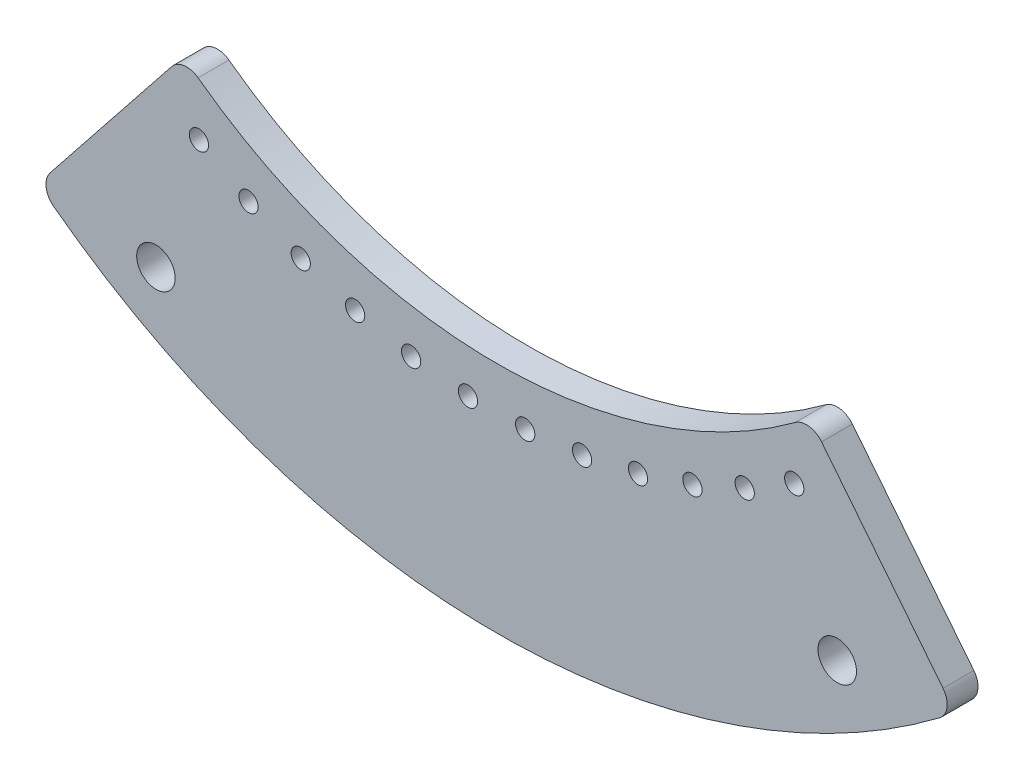
ISO-10303-21;
HEADER;
FILE_DESCRIPTION(('STEP AP214'),'2;1');
FILE_NAME('part.step','',(''),(''),'','','');
FILE_SCHEMA(('AUTOMOTIVE_DESIGN { 1 0 10303 214 1 1 1 1 }'));
ENDSEC;
DATA;
#1=APPLICATION_CONTEXT('core data for automotive mechanical design processes');
#2=APPLICATION_PROTOCOL_DEFINITION('international standard','automotive_design',2000,#1);
#3=PRODUCT_CONTEXT('',#1,'mechanical');
#4=PRODUCT('Part','Part','',(#3));
#5=PRODUCT_RELATED_PRODUCT_CATEGORY('part','',(#4));
#6=PRODUCT_DEFINITION_FORMATION('','',#4);
#7=PRODUCT_DEFINITION_CONTEXT('part definition',#1,'design');
#8=PRODUCT_DEFINITION('design','',#6,#7);
#9=PRODUCT_DEFINITION_SHAPE('','',#8);
#10=(LENGTH_UNIT() NAMED_UNIT(*) SI_UNIT(.MILLI.,.METRE.));
#11=(NAMED_UNIT(*) PLANE_ANGLE_UNIT() SI_UNIT($,.RADIAN.));
#12=(NAMED_UNIT(*) SI_UNIT($,.STERADIAN.) SOLID_ANGLE_UNIT());
#13=UNCERTAINTY_MEASURE_WITH_UNIT(LENGTH_MEASURE(1.E-05),#10,'distance_accuracy_value','');
#14=(GEOMETRIC_REPRESENTATION_CONTEXT(3) GLOBAL_UNCERTAINTY_ASSIGNED_CONTEXT((#13)) GLOBAL_UNIT_ASSIGNED_CONTEXT((#10,
#11,#12)) REPRESENTATION_CONTEXT('',''));
#15=CARTESIAN_POINT('',(0.,0.,0.));
#16=DIRECTION('',(0.,0.,1.));
#17=DIRECTION('',(1.,0.,0.));
#18=AXIS2_PLACEMENT_3D('',#15,#16,#17);
#19=CARTESIAN_POINT('',(0.,0.,1.6));
#20=DIRECTION('',(0.,0.,-1.));
#21=DIRECTION('',(-1.,0.,0.));
#22=AXIS2_PLACEMENT_3D('',#19,#20,#21);
#23=CYLINDRICAL_SURFACE('',#22,26.125);
#24=CARTESIAN_POINT('',(0.,0.,1.6));
#25=DIRECTION('',(0.,0.,-1.));
#26=DIRECTION('',(1.,0.,0.));
#27=AXIS2_PLACEMENT_3D('',#24,#25,#26);
#28=CIRCLE('',#27,26.125);
#29=CARTESIAN_POINT('',(15.4983829956367,-21.0313040375665,1.6));
#30=VERTEX_POINT('',#29);
#31=CARTESIAN_POINT('',(-15.4983829956367,-21.0313040375665,1.6));
#32=VERTEX_POINT('',#31);
#33=EDGE_CURVE('E120',#30,#32,#28,.T.);
#34=ORIENTED_EDGE('',*,*,#33,.F.);
#35=DIRECTION('',(0.,0.,-1.));
#36=VECTOR('',#35,1.);
#37=CARTESIAN_POINT('',(15.4983829956367,-21.0313040375665,1.6));
#38=LINE('',#37,#36);
#39=CARTESIAN_POINT('',(15.4983829956367,-21.0313040375665,0.));
#40=VERTEX_POINT('',#39);
#41=EDGE_CURVE('E105',#30,#40,#38,.T.);
#42=ORIENTED_EDGE('',*,*,#41,.T.);
#43=CARTESIAN_POINT('',(0.,0.,0.));
#44=DIRECTION('',(0.,0.,-1.));
#45=DIRECTION('',(1.,0.,0.));
#46=AXIS2_PLACEMENT_3D('',#43,#44,#45);
#47=CIRCLE('',#46,26.125);
#48=CARTESIAN_POINT('',(-15.4983829956367,-21.0313040375665,0.));
#49=VERTEX_POINT('',#48);
#50=EDGE_CURVE('E117',#40,#49,#47,.T.);
#51=ORIENTED_EDGE('',*,*,#50,.T.);
#52=DIRECTION('',(0.,0.,-1.));
#53=VECTOR('',#52,1.);
#54=CARTESIAN_POINT('',(-15.4983829956367,-21.0313040375665,1.6));
#55=LINE('',#54,#53);
#56=EDGE_CURVE('E122',#49,#32,#55,.F.);
#57=ORIENTED_EDGE('',*,*,#56,.T.);
#58=EDGE_LOOP('',(#34,#42,#51,#57));
#59=FACE_BOUND('',#58,.T.);
#60=ADVANCED_FACE('F35',(#59),#23,.F.);
#61=CARTESIAN_POINT('',(-16.2631948821578,-20.4456380977693,1.6));
#62=DIRECTION('',(0.782608156852413,-0.62251463663762,0.));
#63=DIRECTION('',(0.62251463663762,0.782608156852413,0.));
#64=AXIS2_PLACEMENT_3D('',#61,#62,#63);
#65=PLANE('',#64);
#66=DIRECTION('',(-0.62251463663762,-0.782608156852413,0.));
#67=VECTOR('',#66,1.);
#68=CARTESIAN_POINT('',(-16.2631948821578,-20.4456380977693,0.));
#69=LINE('',#68,#67);
#70=CARTESIAN_POINT('',(-16.8742306929919,-21.2138153927974,0.));
#71=VERTEX_POINT('',#70);
#72=CARTESIAN_POINT('',(-23.1803128075457,-29.1416471419227,0.));
#73=VERTEX_POINT('',#72);
#74=EDGE_CURVE('E126',#71,#73,#69,.T.);
#75=ORIENTED_EDGE('',*,*,#74,.T.);
#76=DIRECTION('',(0.,0.,-1.));
#77=VECTOR('',#76,1.);
#78=CARTESIAN_POINT('',(-23.1803128075457,-29.1416471419227,1.6));
#79=LINE('',#78,#77);
#80=CARTESIAN_POINT('',(-23.1803128075457,-29.1416471419227,1.6));
#81=VERTEX_POINT('',#80);
#82=EDGE_CURVE('E11',#73,#81,#79,.F.);
#83=ORIENTED_EDGE('',*,*,#82,.T.);
#84=DIRECTION('',(-0.62251463663762,-0.782608156852413,0.));
#85=VECTOR('',#84,1.);
#86=CARTESIAN_POINT('',(-16.2631948821578,-20.4456380977693,1.6));
#87=LINE('',#86,#85);
#88=CARTESIAN_POINT('',(-16.8742306929919,-21.2138153927974,1.6));
#89=VERTEX_POINT('',#88);
#90=EDGE_CURVE('E166',#89,#81,#87,.T.);
#91=ORIENTED_EDGE('',*,*,#90,.F.);
#92=DIRECTION('',(0.,0.,-1.));
#93=VECTOR('',#92,1.);
#94=CARTESIAN_POINT('',(-16.8742306929919,-21.2138153927974,1.6));
#95=LINE('',#94,#93);
#96=EDGE_CURVE('E43',#89,#71,#95,.T.);
#97=ORIENTED_EDGE('',*,*,#96,.T.);
#98=EDGE_LOOP('',(#75,#83,#91,#97));
#99=FACE_BOUND('',#98,.T.);
#100=ADVANCED_FACE('F164',(#99),#65,.F.);
#101=CARTESIAN_POINT('',(0.,0.,1.6));
#102=DIRECTION('',(0.,0.,-1.));
#103=DIRECTION('',(-1.,0.,0.));
#104=AXIS2_PLACEMENT_3D('',#101,#102,#103);
#105=CYLINDRICAL_SURFACE('',#104,38.25);
#106=CARTESIAN_POINT('',(0.,0.,0.));
#107=DIRECTION('',(0.,0.,1.));
#108=DIRECTION('',(1.,0.,0.));
#109=AXIS2_PLACEMENT_3D('',#106,#107,#108);
#110=CIRCLE('',#109,38.25);
#111=CARTESIAN_POINT('',(-22.9989853124569,-30.5631996786559,0.));
#112=VERTEX_POINT('',#111);
#113=CARTESIAN_POINT('',(22.9989853124569,-30.5631996786559,0.));
#114=VERTEX_POINT('',#113);
#115=EDGE_CURVE('E130',#112,#114,#110,.T.);
#116=ORIENTED_EDGE('',*,*,#115,.T.);
#117=DIRECTION('',(0.,0.,-1.));
#118=VECTOR('',#117,1.);
#119=CARTESIAN_POINT('',(22.9989853124569,-30.5631996786559,1.6));
#120=LINE('',#119,#118);
#121=CARTESIAN_POINT('',(22.9989853124569,-30.5631996786559,1.6));
#122=VERTEX_POINT('',#121);
#123=EDGE_CURVE('E50',#114,#122,#120,.F.);
#124=ORIENTED_EDGE('',*,*,#123,.T.);
#125=CARTESIAN_POINT('',(0.,0.,1.6));
#126=DIRECTION('',(0.,0.,1.));
#127=DIRECTION('',(1.,0.,0.));
#128=AXIS2_PLACEMENT_3D('',#125,#126,#127);
#129=CIRCLE('',#128,38.25);
#130=CARTESIAN_POINT('',(-22.9989853124569,-30.5631996786559,1.6));
#131=VERTEX_POINT('',#130);
#132=EDGE_CURVE('E174',#131,#122,#129,.T.);
#133=ORIENTED_EDGE('',*,*,#132,.F.);
#134=DIRECTION('',(0.,0.,-1.));
#135=VECTOR('',#134,1.);
#136=CARTESIAN_POINT('',(-22.9989853124569,-30.5631996786559,1.6));
#137=LINE('',#136,#135);
#138=EDGE_CURVE('E157',#131,#112,#137,.T.);
#139=ORIENTED_EDGE('',*,*,#138,.T.);
#140=EDGE_LOOP('',(#116,#124,#133,#139));
#141=FACE_BOUND('',#140,.T.);
#142=ADVANCED_FACE('F173',(#141),#105,.T.);
#143=CARTESIAN_POINT('',(16.2631948821578,-20.4456380977693,1.6));
#144=DIRECTION('',(-0.782608156852413,-0.62251463663762,0.));
#145=DIRECTION('',(0.62251463663762,-0.782608156852413,0.));
#146=AXIS2_PLACEMENT_3D('',#143,#144,#145);
#147=PLANE('',#146);
#148=DIRECTION('',(-0.62251463663762,0.782608156852413,0.));
#149=VECTOR('',#148,1.);
#150=CARTESIAN_POINT('',(16.2631948821578,-20.4456380977693,0.));
#151=LINE('',#150,#149);
#152=CARTESIAN_POINT('',(23.1803128075457,-29.1416471419227,0.));
#153=VERTEX_POINT('',#152);
#154=CARTESIAN_POINT('',(16.8742306929919,-21.2138153927974,0.));
#155=VERTEX_POINT('',#154);
#156=EDGE_CURVE('E140',#153,#155,#151,.T.);
#157=ORIENTED_EDGE('',*,*,#156,.T.);
#158=DIRECTION('',(0.,0.,-1.));
#159=VECTOR('',#158,1.);
#160=CARTESIAN_POINT('',(16.8742306929919,-21.2138153927974,1.6));
#161=LINE('',#160,#159);
#162=CARTESIAN_POINT('',(16.8742306929919,-21.2138153927974,1.6));
#163=VERTEX_POINT('',#162);
#164=EDGE_CURVE('E106',#155,#163,#161,.F.);
#165=ORIENTED_EDGE('',*,*,#164,.T.);
#166=DIRECTION('',(-0.62251463663762,0.782608156852413,0.));
#167=VECTOR('',#166,1.);
#168=CARTESIAN_POINT('',(16.2631948821578,-20.4456380977693,1.6));
#169=LINE('',#168,#167);
#170=CARTESIAN_POINT('',(23.1803128075457,-29.1416471419227,1.6));
#171=VERTEX_POINT('',#170);
#172=EDGE_CURVE('E136',#171,#163,#169,.T.);
#173=ORIENTED_EDGE('',*,*,#172,.F.);
#174=DIRECTION('',(0.,0.,-1.));
#175=VECTOR('',#174,1.);
#176=CARTESIAN_POINT('',(23.1803128075457,-29.1416471419227,1.6));
#177=LINE('',#176,#175);
#178=EDGE_CURVE('E111',#171,#153,#177,.T.);
#179=ORIENTED_EDGE('',*,*,#178,.T.);
#180=EDGE_LOOP('',(#157,#165,#173,#179));
#181=FACE_BOUND('',#180,.T.);
#182=ADVANCED_FACE('F273',(#181),#147,.F.);
#183=CARTESIAN_POINT('',(0.,0.,1.6));
#184=DIRECTION('',(0.,0.,1.));
#185=DIRECTION('',(1.,0.,0.));
#186=AXIS2_PLACEMENT_3D('',#183,#184,#185);
#187=PLANE('',#186);
#188=CARTESIAN_POINT('',(-17.6874999999998,-30.6356486588746,1.6));
#189=DIRECTION('',(0.,0.,1.));
#190=DIRECTION('',(1.,0.,0.));
#191=AXIS2_PLACEMENT_3D('',#188,#189,#190);
#192=CIRCLE('',#191,1.);
#193=CARTESIAN_POINT('',(-16.6874999999998,-30.6356486588746,1.6));
#194=VERTEX_POINT('',#193);
#195=EDGE_CURVE('E255',#194,#194,#192,.T.);
#196=ORIENTED_EDGE('',*,*,#195,.F.);
#197=EDGE_LOOP('',(#196));
#198=FACE_BOUND('',#197,.T.);
#199=CARTESIAN_POINT('',(17.6874999999998,-30.6356486588746,1.6));
#200=DIRECTION('',(0.,0.,1.));
#201=DIRECTION('',(1.,0.,0.));
#202=AXIS2_PLACEMENT_3D('',#199,#200,#201);
#203=CIRCLE('',#202,1.);
#204=CARTESIAN_POINT('',(18.6874999999998,-30.6356486588746,1.6));
#205=VERTEX_POINT('',#204);
#206=EDGE_CURVE('E249',#205,#205,#203,.T.);
#207=ORIENTED_EDGE('',*,*,#206,.F.);
#208=EDGE_LOOP('',(#207));
#209=FACE_BOUND('',#208,.T.);
#210=CARTESIAN_POINT('',(-15.4541326185514,-23.7972773654514,1.6));
#211=DIRECTION('',(0.,0.,1.));
#212=DIRECTION('',(1.,0.,0.));
#213=AXIS2_PLACEMENT_3D('',#210,#211,#212);
#214=CIRCLE('',#213,0.500000000000001);
#215=CARTESIAN_POINT('',(-14.9541326185514,-23.7972773654514,1.6));
#216=VERTEX_POINT('',#215);
#217=EDGE_CURVE('E133',#216,#216,#214,.T.);
#218=ORIENTED_EDGE('',*,*,#217,.F.);
#219=EDGE_LOOP('',(#218));
#220=FACE_BOUND('',#219,.T.);
#221=CARTESIAN_POINT('',(-12.8819804301097,-25.2823101238449,1.6));
#222=DIRECTION('',(0.,0.,1.));
#223=DIRECTION('',(1.,0.,0.));
#224=AXIS2_PLACEMENT_3D('',#221,#222,#223);
#225=CIRCLE('',#224,0.500000000000001);
#226=CARTESIAN_POINT('',(-12.3819804301097,-25.2823101238449,1.6));
#227=VERTEX_POINT('',#226);
#228=EDGE_CURVE('E241',#227,#227,#225,.T.);
#229=ORIENTED_EDGE('',*,*,#228,.F.);
#230=EDGE_LOOP('',(#229));
#231=FACE_BOUND('',#230,.T.);
#232=CARTESIAN_POINT('',(-10.1686905683479,-26.4903446018581,1.6));
#233=DIRECTION('',(0.,0.,1.));
#234=DIRECTION('',(1.,0.,0.));
#235=AXIS2_PLACEMENT_3D('',#232,#233,#234);
#236=CIRCLE('',#235,0.500000000000001);
#237=CARTESIAN_POINT('',(-9.66869056834791,-26.4903446018581,1.6));
#238=VERTEX_POINT('',#237);
#239=EDGE_CURVE('E235',#238,#238,#236,.T.);
#240=ORIENTED_EDGE('',*,*,#239,.F.);
#241=EDGE_LOOP('',(#240));
#242=FACE_BOUND('',#241,.T.);
#243=CARTESIAN_POINT('',(-7.34399040478404,-27.4081453209523,1.6));
#244=DIRECTION('',(0.,0.,1.));
#245=DIRECTION('',(1.,0.,0.));
#246=AXIS2_PLACEMENT_3D('',#243,#244,#245);
#247=CIRCLE('',#246,0.500000000000003);
#248=CARTESIAN_POINT('',(-6.84399040478403,-27.4081453209523,1.6));
#249=VERTEX_POINT('',#248);
#250=EDGE_CURVE('E229',#249,#249,#247,.T.);
#251=ORIENTED_EDGE('',*,*,#250,.F.);
#252=EDGE_LOOP('',(#251));
#253=FACE_BOUND('',#252,.T.);
#254=CARTESIAN_POINT('',(-4.43882794551655,-28.025656664387,1.6));
#255=DIRECTION('',(0.,0.,1.));
#256=DIRECTION('',(1.,0.,0.));
#257=AXIS2_PLACEMENT_3D('',#254,#255,#256);
#258=CIRCLE('',#257,0.500000000000001);
#259=CARTESIAN_POINT('',(-3.93882794551655,-28.025656664387,1.6));
#260=VERTEX_POINT('',#259);
#261=EDGE_CURVE('E223',#260,#260,#258,.T.);
#262=ORIENTED_EDGE('',*,*,#261,.F.);
#263=EDGE_LOOP('',(#262));
#264=FACE_BOUND('',#263,.T.);
#265=CARTESIAN_POINT('',(-1.48503275839352,-28.336113048661,1.6));
#266=DIRECTION('',(0.,0.,1.));
#267=DIRECTION('',(1.,0.,0.));
#268=AXIS2_PLACEMENT_3D('',#265,#266,#267);
#269=CIRCLE('',#268,0.500000000000002);
#270=CARTESIAN_POINT('',(-0.985032758393521,-28.336113048661,1.6));
#271=VERTEX_POINT('',#270);
#272=EDGE_CURVE('E217',#271,#271,#269,.T.);
#273=ORIENTED_EDGE('',*,*,#272,.F.);
#274=EDGE_LOOP('',(#273));
#275=FACE_BOUND('',#274,.T.);
#276=CARTESIAN_POINT('',(1.48503275839354,-28.336113048661,1.6));
#277=DIRECTION('',(0.,0.,1.));
#278=DIRECTION('',(1.,0.,0.));
#279=AXIS2_PLACEMENT_3D('',#276,#277,#278);
#280=CIRCLE('',#279,0.5);
#281=CARTESIAN_POINT('',(1.98503275839354,-28.336113048661,1.6));
#282=VERTEX_POINT('',#281);
#283=EDGE_CURVE('E211',#282,#282,#280,.T.);
#284=ORIENTED_EDGE('',*,*,#283,.F.);
#285=EDGE_LOOP('',(#284));
#286=FACE_BOUND('',#285,.T.);
#287=CARTESIAN_POINT('',(4.43882794551656,-28.025656664387,1.6));
#288=DIRECTION('',(0.,0.,1.));
#289=DIRECTION('',(1.,0.,0.));
#290=AXIS2_PLACEMENT_3D('',#287,#288,#289);
#291=CIRCLE('',#290,0.500000000000002);
#292=CARTESIAN_POINT('',(4.93882794551657,-28.025656664387,1.6));
#293=VERTEX_POINT('',#292);
#294=EDGE_CURVE('E205',#293,#293,#291,.T.);
#295=ORIENTED_EDGE('',*,*,#294,.F.);
#296=EDGE_LOOP('',(#295));
#297=FACE_BOUND('',#296,.T.);
#298=CARTESIAN_POINT('',(7.34399040478405,-27.4081453209523,1.6));
#299=DIRECTION('',(0.,0.,1.));
#300=DIRECTION('',(1.,0.,0.));
#301=AXIS2_PLACEMENT_3D('',#298,#299,#300);
#302=CIRCLE('',#301,0.500000000000008);
#303=CARTESIAN_POINT('',(7.84399040478406,-27.4081453209523,1.6));
#304=VERTEX_POINT('',#303);
#305=EDGE_CURVE('E199',#304,#304,#302,.T.);
#306=ORIENTED_EDGE('',*,*,#305,.F.);
#307=EDGE_LOOP('',(#306));
#308=FACE_BOUND('',#307,.T.);
#309=CARTESIAN_POINT('',(10.1686905683479,-26.4903446018581,1.6));
#310=DIRECTION('',(0.,0.,1.));
#311=DIRECTION('',(1.,0.,0.));
#312=AXIS2_PLACEMENT_3D('',#309,#310,#311);
#313=CIRCLE('',#312,0.499999999999996);
#314=CARTESIAN_POINT('',(10.6686905683479,-26.4903446018581,1.6));
#315=VERTEX_POINT('',#314);
#316=EDGE_CURVE('E193',#315,#315,#313,.T.);
#317=ORIENTED_EDGE('',*,*,#316,.F.);
#318=EDGE_LOOP('',(#317));
#319=FACE_BOUND('',#318,.T.);
#320=CARTESIAN_POINT('',(12.8819804301097,-25.2823101238449,1.6));
#321=DIRECTION('',(0.,0.,1.));
#322=DIRECTION('',(1.,0.,0.));
#323=AXIS2_PLACEMENT_3D('',#320,#321,#322);
#324=CIRCLE('',#323,0.5);
#325=CARTESIAN_POINT('',(13.3819804301097,-25.2823101238449,1.6));
#326=VERTEX_POINT('',#325);
#327=EDGE_CURVE('E187',#326,#326,#324,.T.);
#328=ORIENTED_EDGE('',*,*,#327,.F.);
#329=EDGE_LOOP('',(#328));
#330=FACE_BOUND('',#329,.T.);
#331=CARTESIAN_POINT('',(15.4541326185514,-23.7972773654514,1.6));
#332=DIRECTION('',(0.,0.,1.));
#333=DIRECTION('',(1.,0.,0.));
#334=AXIS2_PLACEMENT_3D('',#331,#332,#333);
#335=CIRCLE('',#334,0.5);
#336=CARTESIAN_POINT('',(15.9541326185514,-23.7972773654514,1.6));
#337=VERTEX_POINT('',#336);
#338=EDGE_CURVE('E180',#337,#337,#335,.T.);
#339=ORIENTED_EDGE('',*,*,#338,.F.);
#340=EDGE_LOOP('',(#339));
#341=FACE_BOUND('',#340,.T.);
#342=ORIENTED_EDGE('',*,*,#172,.T.);
#343=CARTESIAN_POINT('',(16.0916225361395,-21.836330029435,1.6));
#344=DIRECTION('',(0.,0.,1.));
#345=DIRECTION('',(1.,0.,0.));
#346=AXIS2_PLACEMENT_3D('',#343,#344,#345);
#347=CIRCLE('',#346,1.);
#348=EDGE_CURVE('E155',#163,#30,#347,.T.);
#349=ORIENTED_EDGE('',*,*,#348,.T.);
#350=ORIENTED_EDGE('',*,*,#33,.T.);
#351=CARTESIAN_POINT('',(-16.0916225361395,-21.836330029435,1.6));
#352=DIRECTION('',(0.,0.,1.));
#353=DIRECTION('',(1.,0.,0.));
#354=AXIS2_PLACEMENT_3D('',#351,#352,#353);
#355=CIRCLE('',#354,1.);
#356=EDGE_CURVE('E150',#32,#89,#355,.T.);
#357=ORIENTED_EDGE('',*,*,#356,.T.);
#358=ORIENTED_EDGE('',*,*,#90,.T.);
#359=CARTESIAN_POINT('',(-22.3977046506933,-29.7641617785603,1.6));
#360=DIRECTION('',(0.,0.,1.));
#361=DIRECTION('',(1.,0.,0.));
#362=AXIS2_PLACEMENT_3D('',#359,#360,#361);
#363=CIRCLE('',#362,1.);
#364=EDGE_CURVE('E57',#81,#131,#363,.T.);
#365=ORIENTED_EDGE('',*,*,#364,.T.);
#366=ORIENTED_EDGE('',*,*,#132,.T.);
#367=CARTESIAN_POINT('',(22.3977046506933,-29.7641617785603,1.6));
#368=DIRECTION('',(0.,0.,1.));
#369=DIRECTION('',(1.,0.,0.));
#370=AXIS2_PLACEMENT_3D('',#367,#368,#369);
#371=CIRCLE('',#370,1.);
#372=EDGE_CURVE('E153',#122,#171,#371,.T.);
#373=ORIENTED_EDGE('',*,*,#372,.T.);
#374=EDGE_LOOP('',(#342,#349,#350,#357,#358,#365,#366,#373));
#375=FACE_BOUND('',#374,.T.);
#376=ADVANCED_FACE('F270',(#198,#209,#220,#231,#242,#253,#264,#275,#286,#297,#308,#319,#330,
#341,#375),#187,.T.);
#377=CARTESIAN_POINT('',(0.,0.,0.));
#378=DIRECTION('',(0.,0.,1.));
#379=DIRECTION('',(1.,0.,0.));
#380=AXIS2_PLACEMENT_3D('',#377,#378,#379);
#381=PLANE('',#380);
#382=CARTESIAN_POINT('',(-17.6874999999998,-30.6356486588746,0.));
#383=DIRECTION('',(0.,0.,1.));
#384=DIRECTION('',(1.,0.,0.));
#385=AXIS2_PLACEMENT_3D('',#382,#383,#384);
#386=CIRCLE('',#385,1.);
#387=CARTESIAN_POINT('',(-16.6874999999998,-30.6356486588746,0.));
#388=VERTEX_POINT('',#387);
#389=EDGE_CURVE('E184',#388,#388,#386,.T.);
#390=ORIENTED_EDGE('',*,*,#389,.T.);
#391=EDGE_LOOP('',(#390));
#392=FACE_BOUND('',#391,.T.);
#393=CARTESIAN_POINT('',(17.6874999999998,-30.6356486588746,0.));
#394=DIRECTION('',(0.,0.,1.));
#395=DIRECTION('',(1.,0.,0.));
#396=AXIS2_PLACEMENT_3D('',#393,#394,#395);
#397=CIRCLE('',#396,1.);
#398=CARTESIAN_POINT('',(18.6874999999998,-30.6356486588746,0.));
#399=VERTEX_POINT('',#398);
#400=EDGE_CURVE('E252',#399,#399,#397,.T.);
#401=ORIENTED_EDGE('',*,*,#400,.T.);
#402=EDGE_LOOP('',(#401));
#403=FACE_BOUND('',#402,.T.);
#404=CARTESIAN_POINT('',(-15.4541326185514,-23.7972773654514,0.));
#405=DIRECTION('',(0.,0.,1.));
#406=DIRECTION('',(1.,0.,0.));
#407=AXIS2_PLACEMENT_3D('',#404,#405,#406);
#408=CIRCLE('',#407,0.500000000000001);
#409=CARTESIAN_POINT('',(-14.9541326185514,-23.7972773654514,0.));
#410=VERTEX_POINT('',#409);
#411=EDGE_CURVE('E127',#410,#410,#408,.T.);
#412=ORIENTED_EDGE('',*,*,#411,.T.);
#413=EDGE_LOOP('',(#412));
#414=FACE_BOUND('',#413,.T.);
#415=CARTESIAN_POINT('',(-12.8819804301097,-25.2823101238449,0.));
#416=DIRECTION('',(0.,0.,1.));
#417=DIRECTION('',(1.,0.,0.));
#418=AXIS2_PLACEMENT_3D('',#415,#416,#417);
#419=CIRCLE('',#418,0.500000000000001);
#420=CARTESIAN_POINT('',(-12.3819804301097,-25.2823101238449,0.));
#421=VERTEX_POINT('',#420);
#422=EDGE_CURVE('E244',#421,#421,#419,.T.);
#423=ORIENTED_EDGE('',*,*,#422,.T.);
#424=EDGE_LOOP('',(#423));
#425=FACE_BOUND('',#424,.T.);
#426=CARTESIAN_POINT('',(-10.1686905683479,-26.4903446018581,0.));
#427=DIRECTION('',(0.,0.,1.));
#428=DIRECTION('',(1.,0.,0.));
#429=AXIS2_PLACEMENT_3D('',#426,#427,#428);
#430=CIRCLE('',#429,0.500000000000001);
#431=CARTESIAN_POINT('',(-9.66869056834791,-26.4903446018581,0.));
#432=VERTEX_POINT('',#431);
#433=EDGE_CURVE('E238',#432,#432,#430,.T.);
#434=ORIENTED_EDGE('',*,*,#433,.T.);
#435=EDGE_LOOP('',(#434));
#436=FACE_BOUND('',#435,.T.);
#437=CARTESIAN_POINT('',(-7.34399040478404,-27.4081453209523,0.));
#438=DIRECTION('',(0.,0.,1.));
#439=DIRECTION('',(1.,0.,0.));
#440=AXIS2_PLACEMENT_3D('',#437,#438,#439);
#441=CIRCLE('',#440,0.500000000000003);
#442=CARTESIAN_POINT('',(-6.84399040478403,-27.4081453209523,0.));
#443=VERTEX_POINT('',#442);
#444=EDGE_CURVE('E232',#443,#443,#441,.T.);
#445=ORIENTED_EDGE('',*,*,#444,.T.);
#446=EDGE_LOOP('',(#445));
#447=FACE_BOUND('',#446,.T.);
#448=CARTESIAN_POINT('',(-4.43882794551655,-28.025656664387,0.));
#449=DIRECTION('',(0.,0.,1.));
#450=DIRECTION('',(1.,0.,0.));
#451=AXIS2_PLACEMENT_3D('',#448,#449,#450);
#452=CIRCLE('',#451,0.500000000000001);
#453=CARTESIAN_POINT('',(-3.93882794551655,-28.025656664387,0.));
#454=VERTEX_POINT('',#453);
#455=EDGE_CURVE('E226',#454,#454,#452,.T.);
#456=ORIENTED_EDGE('',*,*,#455,.T.);
#457=EDGE_LOOP('',(#456));
#458=FACE_BOUND('',#457,.T.);
#459=CARTESIAN_POINT('',(-1.48503275839352,-28.336113048661,0.));
#460=DIRECTION('',(0.,0.,1.));
#461=DIRECTION('',(1.,0.,0.));
#462=AXIS2_PLACEMENT_3D('',#459,#460,#461);
#463=CIRCLE('',#462,0.500000000000002);
#464=CARTESIAN_POINT('',(-0.985032758393521,-28.336113048661,0.));
#465=VERTEX_POINT('',#464);
#466=EDGE_CURVE('E220',#465,#465,#463,.T.);
#467=ORIENTED_EDGE('',*,*,#466,.T.);
#468=EDGE_LOOP('',(#467));
#469=FACE_BOUND('',#468,.T.);
#470=CARTESIAN_POINT('',(1.48503275839354,-28.336113048661,0.));
#471=DIRECTION('',(0.,0.,1.));
#472=DIRECTION('',(1.,0.,0.));
#473=AXIS2_PLACEMENT_3D('',#470,#471,#472);
#474=CIRCLE('',#473,0.5);
#475=CARTESIAN_POINT('',(1.98503275839354,-28.336113048661,0.));
#476=VERTEX_POINT('',#475);
#477=EDGE_CURVE('E214',#476,#476,#474,.T.);
#478=ORIENTED_EDGE('',*,*,#477,.T.);
#479=EDGE_LOOP('',(#478));
#480=FACE_BOUND('',#479,.T.);
#481=CARTESIAN_POINT('',(4.43882794551656,-28.025656664387,0.));
#482=DIRECTION('',(0.,0.,1.));
#483=DIRECTION('',(1.,0.,0.));
#484=AXIS2_PLACEMENT_3D('',#481,#482,#483);
#485=CIRCLE('',#484,0.500000000000002);
#486=CARTESIAN_POINT('',(4.93882794551657,-28.025656664387,0.));
#487=VERTEX_POINT('',#486);
#488=EDGE_CURVE('E208',#487,#487,#485,.T.);
#489=ORIENTED_EDGE('',*,*,#488,.T.);
#490=EDGE_LOOP('',(#489));
#491=FACE_BOUND('',#490,.T.);
#492=CARTESIAN_POINT('',(7.34399040478405,-27.4081453209523,0.));
#493=DIRECTION('',(0.,0.,1.));
#494=DIRECTION('',(1.,0.,0.));
#495=AXIS2_PLACEMENT_3D('',#492,#493,#494);
#496=CIRCLE('',#495,0.500000000000008);
#497=CARTESIAN_POINT('',(7.84399040478406,-27.4081453209523,0.));
#498=VERTEX_POINT('',#497);
#499=EDGE_CURVE('E202',#498,#498,#496,.T.);
#500=ORIENTED_EDGE('',*,*,#499,.T.);
#501=EDGE_LOOP('',(#500));
#502=FACE_BOUND('',#501,.T.);
#503=CARTESIAN_POINT('',(10.1686905683479,-26.4903446018581,0.));
#504=DIRECTION('',(0.,0.,1.));
#505=DIRECTION('',(1.,0.,0.));
#506=AXIS2_PLACEMENT_3D('',#503,#504,#505);
#507=CIRCLE('',#506,0.499999999999996);
#508=CARTESIAN_POINT('',(10.6686905683479,-26.4903446018581,0.));
#509=VERTEX_POINT('',#508);
#510=EDGE_CURVE('E196',#509,#509,#507,.T.);
#511=ORIENTED_EDGE('',*,*,#510,.T.);
#512=EDGE_LOOP('',(#511));
#513=FACE_BOUND('',#512,.T.);
#514=CARTESIAN_POINT('',(12.8819804301097,-25.2823101238449,0.));
#515=DIRECTION('',(0.,0.,1.));
#516=DIRECTION('',(1.,0.,0.));
#517=AXIS2_PLACEMENT_3D('',#514,#515,#516);
#518=CIRCLE('',#517,0.5);
#519=CARTESIAN_POINT('',(13.3819804301097,-25.2823101238449,0.));
#520=VERTEX_POINT('',#519);
#521=EDGE_CURVE('E190',#520,#520,#518,.T.);
#522=ORIENTED_EDGE('',*,*,#521,.T.);
#523=EDGE_LOOP('',(#522));
#524=FACE_BOUND('',#523,.T.);
#525=CARTESIAN_POINT('',(15.4541326185514,-23.7972773654514,0.));
#526=DIRECTION('',(0.,0.,1.));
#527=DIRECTION('',(1.,0.,0.));
#528=AXIS2_PLACEMENT_3D('',#525,#526,#527);
#529=CIRCLE('',#528,0.5);
#530=CARTESIAN_POINT('',(15.9541326185514,-23.7972773654514,0.));
#531=VERTEX_POINT('',#530);
#532=EDGE_CURVE('E183',#531,#531,#529,.T.);
#533=ORIENTED_EDGE('',*,*,#532,.T.);
#534=EDGE_LOOP('',(#533));
#535=FACE_BOUND('',#534,.T.);
#536=ORIENTED_EDGE('',*,*,#50,.F.);
#537=CARTESIAN_POINT('',(16.0916225361395,-21.836330029435,0.));
#538=DIRECTION('',(0.,0.,1.));
#539=DIRECTION('',(1.,0.,0.));
#540=AXIS2_PLACEMENT_3D('',#537,#538,#539);
#541=CIRCLE('',#540,1.);
#542=EDGE_CURVE('E101',#40,#155,#541,.F.);
#543=ORIENTED_EDGE('',*,*,#542,.T.);
#544=ORIENTED_EDGE('',*,*,#156,.F.);
#545=CARTESIAN_POINT('',(22.3977046506933,-29.7641617785603,0.));
#546=DIRECTION('',(0.,0.,1.));
#547=DIRECTION('',(1.,0.,0.));
#548=AXIS2_PLACEMENT_3D('',#545,#546,#547);
#549=CIRCLE('',#548,1.);
#550=EDGE_CURVE('E112',#153,#114,#549,.F.);
#551=ORIENTED_EDGE('',*,*,#550,.T.);
#552=ORIENTED_EDGE('',*,*,#115,.F.);
#553=CARTESIAN_POINT('',(-22.3977046506933,-29.7641617785603,0.));
#554=DIRECTION('',(0.,0.,1.));
#555=DIRECTION('',(1.,0.,0.));
#556=AXIS2_PLACEMENT_3D('',#553,#554,#555);
#557=CIRCLE('',#556,1.);
#558=EDGE_CURVE('E144',#112,#73,#557,.F.);
#559=ORIENTED_EDGE('',*,*,#558,.T.);
#560=ORIENTED_EDGE('',*,*,#74,.F.);
#561=CARTESIAN_POINT('',(-16.0916225361395,-21.836330029435,0.));
#562=DIRECTION('',(0.,0.,1.));
#563=DIRECTION('',(1.,0.,0.));
#564=AXIS2_PLACEMENT_3D('',#561,#562,#563);
#565=CIRCLE('',#564,1.);
#566=EDGE_CURVE('E121',#71,#49,#565,.F.);
#567=ORIENTED_EDGE('',*,*,#566,.T.);
#568=EDGE_LOOP('',(#536,#543,#544,#551,#552,#559,#560,#567));
#569=FACE_BOUND('',#568,.T.);
#570=ADVANCED_FACE('F124',(#392,#403,#414,#425,#436,#447,#458,#469,#480,#491,#502,#513,#524,
#535,#569),#381,.F.);
#571=CARTESIAN_POINT('',(15.4541326185514,-23.7972773654514,0.));
#572=DIRECTION('',(0.,0.,1.));
#573=DIRECTION('',(1.,0.,0.));
#574=AXIS2_PLACEMENT_3D('',#571,#572,#573);
#575=CYLINDRICAL_SURFACE('',#574,0.5);
#576=ORIENTED_EDGE('',*,*,#532,.F.);
#577=EDGE_LOOP('',(#576));
#578=FACE_BOUND('',#577,.T.);
#579=ORIENTED_EDGE('',*,*,#338,.T.);
#580=EDGE_LOOP('',(#579));
#581=FACE_BOUND('',#580,.T.);
#582=ADVANCED_FACE('F324',(#578,#581),#575,.F.);
#583=CARTESIAN_POINT('',(12.8819804301097,-25.2823101238449,0.));
#584=DIRECTION('',(0.,0.,1.));
#585=DIRECTION('',(1.,0.,0.));
#586=AXIS2_PLACEMENT_3D('',#583,#584,#585);
#587=CYLINDRICAL_SURFACE('',#586,0.5);
#588=ORIENTED_EDGE('',*,*,#521,.F.);
#589=EDGE_LOOP('',(#588));
#590=FACE_BOUND('',#589,.T.);
#591=ORIENTED_EDGE('',*,*,#327,.T.);
#592=EDGE_LOOP('',(#591));
#593=FACE_BOUND('',#592,.T.);
#594=ADVANCED_FACE('F328',(#590,#593),#587,.F.);
#595=CARTESIAN_POINT('',(10.1686905683479,-26.4903446018581,0.));
#596=DIRECTION('',(0.,0.,1.));
#597=DIRECTION('',(1.,0.,0.));
#598=AXIS2_PLACEMENT_3D('',#595,#596,#597);
#599=CYLINDRICAL_SURFACE('',#598,0.499999999999996);
#600=ORIENTED_EDGE('',*,*,#510,.F.);
#601=EDGE_LOOP('',(#600));
#602=FACE_BOUND('',#601,.T.);
#603=ORIENTED_EDGE('',*,*,#316,.T.);
#604=EDGE_LOOP('',(#603));
#605=FACE_BOUND('',#604,.T.);
#606=ADVANCED_FACE('F332',(#602,#605),#599,.F.);
#607=CARTESIAN_POINT('',(7.34399040478405,-27.4081453209523,0.));
#608=DIRECTION('',(0.,0.,1.));
#609=DIRECTION('',(1.,0.,0.));
#610=AXIS2_PLACEMENT_3D('',#607,#608,#609);
#611=CYLINDRICAL_SURFACE('',#610,0.500000000000008);
#612=ORIENTED_EDGE('',*,*,#499,.F.);
#613=EDGE_LOOP('',(#612));
#614=FACE_BOUND('',#613,.T.);
#615=ORIENTED_EDGE('',*,*,#305,.T.);
#616=EDGE_LOOP('',(#615));
#617=FACE_BOUND('',#616,.T.);
#618=ADVANCED_FACE('F336',(#614,#617),#611,.F.);
#619=CARTESIAN_POINT('',(4.43882794551656,-28.025656664387,0.));
#620=DIRECTION('',(0.,0.,1.));
#621=DIRECTION('',(1.,0.,0.));
#622=AXIS2_PLACEMENT_3D('',#619,#620,#621);
#623=CYLINDRICAL_SURFACE('',#622,0.500000000000002);
#624=ORIENTED_EDGE('',*,*,#488,.F.);
#625=EDGE_LOOP('',(#624));
#626=FACE_BOUND('',#625,.T.);
#627=ORIENTED_EDGE('',*,*,#294,.T.);
#628=EDGE_LOOP('',(#627));
#629=FACE_BOUND('',#628,.T.);
#630=ADVANCED_FACE('F340',(#626,#629),#623,.F.);
#631=CARTESIAN_POINT('',(1.48503275839354,-28.336113048661,0.));
#632=DIRECTION('',(0.,0.,1.));
#633=DIRECTION('',(1.,0.,0.));
#634=AXIS2_PLACEMENT_3D('',#631,#632,#633);
#635=CYLINDRICAL_SURFACE('',#634,0.5);
#636=ORIENTED_EDGE('',*,*,#477,.F.);
#637=EDGE_LOOP('',(#636));
#638=FACE_BOUND('',#637,.T.);
#639=ORIENTED_EDGE('',*,*,#283,.T.);
#640=EDGE_LOOP('',(#639));
#641=FACE_BOUND('',#640,.T.);
#642=ADVANCED_FACE('F344',(#638,#641),#635,.F.);
#643=CARTESIAN_POINT('',(-1.48503275839352,-28.336113048661,0.));
#644=DIRECTION('',(0.,0.,1.));
#645=DIRECTION('',(1.,0.,0.));
#646=AXIS2_PLACEMENT_3D('',#643,#644,#645);
#647=CYLINDRICAL_SURFACE('',#646,0.500000000000002);
#648=ORIENTED_EDGE('',*,*,#466,.F.);
#649=EDGE_LOOP('',(#648));
#650=FACE_BOUND('',#649,.T.);
#651=ORIENTED_EDGE('',*,*,#272,.T.);
#652=EDGE_LOOP('',(#651));
#653=FACE_BOUND('',#652,.T.);
#654=ADVANCED_FACE('F348',(#650,#653),#647,.F.);
#655=CARTESIAN_POINT('',(-4.43882794551655,-28.025656664387,0.));
#656=DIRECTION('',(0.,0.,1.));
#657=DIRECTION('',(1.,0.,0.));
#658=AXIS2_PLACEMENT_3D('',#655,#656,#657);
#659=CYLINDRICAL_SURFACE('',#658,0.500000000000001);
#660=ORIENTED_EDGE('',*,*,#455,.F.);
#661=EDGE_LOOP('',(#660));
#662=FACE_BOUND('',#661,.T.);
#663=ORIENTED_EDGE('',*,*,#261,.T.);
#664=EDGE_LOOP('',(#663));
#665=FACE_BOUND('',#664,.T.);
#666=ADVANCED_FACE('F352',(#662,#665),#659,.F.);
#667=CARTESIAN_POINT('',(-7.34399040478404,-27.4081453209523,0.));
#668=DIRECTION('',(0.,0.,1.));
#669=DIRECTION('',(1.,0.,0.));
#670=AXIS2_PLACEMENT_3D('',#667,#668,#669);
#671=CYLINDRICAL_SURFACE('',#670,0.500000000000003);
#672=ORIENTED_EDGE('',*,*,#444,.F.);
#673=EDGE_LOOP('',(#672));
#674=FACE_BOUND('',#673,.T.);
#675=ORIENTED_EDGE('',*,*,#250,.T.);
#676=EDGE_LOOP('',(#675));
#677=FACE_BOUND('',#676,.T.);
#678=ADVANCED_FACE('F356',(#674,#677),#671,.F.);
#679=CARTESIAN_POINT('',(-10.1686905683479,-26.4903446018581,0.));
#680=DIRECTION('',(0.,0.,1.));
#681=DIRECTION('',(1.,0.,0.));
#682=AXIS2_PLACEMENT_3D('',#679,#680,#681);
#683=CYLINDRICAL_SURFACE('',#682,0.500000000000001);
#684=ORIENTED_EDGE('',*,*,#433,.F.);
#685=EDGE_LOOP('',(#684));
#686=FACE_BOUND('',#685,.T.);
#687=ORIENTED_EDGE('',*,*,#239,.T.);
#688=EDGE_LOOP('',(#687));
#689=FACE_BOUND('',#688,.T.);
#690=ADVANCED_FACE('F360',(#686,#689),#683,.F.);
#691=CARTESIAN_POINT('',(-12.8819804301097,-25.2823101238449,0.));
#692=DIRECTION('',(0.,0.,1.));
#693=DIRECTION('',(1.,0.,0.));
#694=AXIS2_PLACEMENT_3D('',#691,#692,#693);
#695=CYLINDRICAL_SURFACE('',#694,0.500000000000001);
#696=ORIENTED_EDGE('',*,*,#422,.F.);
#697=EDGE_LOOP('',(#696));
#698=FACE_BOUND('',#697,.T.);
#699=ORIENTED_EDGE('',*,*,#228,.T.);
#700=EDGE_LOOP('',(#699));
#701=FACE_BOUND('',#700,.T.);
#702=ADVANCED_FACE('F364',(#698,#701),#695,.F.);
#703=CARTESIAN_POINT('',(-15.4541326185514,-23.7972773654514,0.));
#704=DIRECTION('',(0.,0.,1.));
#705=DIRECTION('',(1.,0.,0.));
#706=AXIS2_PLACEMENT_3D('',#703,#704,#705);
#707=CYLINDRICAL_SURFACE('',#706,0.500000000000001);
#708=ORIENTED_EDGE('',*,*,#411,.F.);
#709=EDGE_LOOP('',(#708));
#710=FACE_BOUND('',#709,.T.);
#711=ORIENTED_EDGE('',*,*,#217,.T.);
#712=EDGE_LOOP('',(#711));
#713=FACE_BOUND('',#712,.T.);
#714=ADVANCED_FACE('F368',(#710,#713),#707,.F.);
#715=CARTESIAN_POINT('',(17.6874999999998,-30.6356486588746,0.));
#716=DIRECTION('',(0.,0.,1.));
#717=DIRECTION('',(1.,0.,0.));
#718=AXIS2_PLACEMENT_3D('',#715,#716,#717);
#719=CYLINDRICAL_SURFACE('',#718,1.);
#720=ORIENTED_EDGE('',*,*,#400,.F.);
#721=EDGE_LOOP('',(#720));
#722=FACE_BOUND('',#721,.T.);
#723=ORIENTED_EDGE('',*,*,#206,.T.);
#724=EDGE_LOOP('',(#723));
#725=FACE_BOUND('',#724,.T.);
#726=ADVANCED_FACE('F266',(#722,#725),#719,.F.);
#727=CARTESIAN_POINT('',(-17.6874999999998,-30.6356486588746,0.));
#728=DIRECTION('',(0.,0.,1.));
#729=DIRECTION('',(1.,0.,0.));
#730=AXIS2_PLACEMENT_3D('',#727,#728,#729);
#731=CYLINDRICAL_SURFACE('',#730,1.);
#732=ORIENTED_EDGE('',*,*,#389,.F.);
#733=EDGE_LOOP('',(#732));
#734=FACE_BOUND('',#733,.T.);
#735=ORIENTED_EDGE('',*,*,#195,.T.);
#736=EDGE_LOOP('',(#735));
#737=FACE_BOUND('',#736,.T.);
#738=ADVANCED_FACE('F263',(#734,#737),#731,.F.);
#739=CARTESIAN_POINT('',(16.0916225361395,-21.836330029435,1.6));
#740=DIRECTION('',(0.,0.,-1.));
#741=DIRECTION('',(-1.,0.,0.));
#742=AXIS2_PLACEMENT_3D('',#739,#740,#741);
#743=CYLINDRICAL_SURFACE('',#742,1.);
#744=ORIENTED_EDGE('',*,*,#348,.F.);
#745=ORIENTED_EDGE('',*,*,#164,.F.);
#746=ORIENTED_EDGE('',*,*,#542,.F.);
#747=ORIENTED_EDGE('',*,*,#41,.F.);
#748=EDGE_LOOP('',(#744,#745,#746,#747));
#749=FACE_BOUND('',#748,.T.);
#750=ADVANCED_FACE('F104',(#749),#743,.T.);
#751=CARTESIAN_POINT('',(22.3977046506933,-29.7641617785603,1.6));
#752=DIRECTION('',(0.,0.,-1.));
#753=DIRECTION('',(-1.,0.,0.));
#754=AXIS2_PLACEMENT_3D('',#751,#752,#753);
#755=CYLINDRICAL_SURFACE('',#754,1.);
#756=ORIENTED_EDGE('',*,*,#372,.F.);
#757=ORIENTED_EDGE('',*,*,#123,.F.);
#758=ORIENTED_EDGE('',*,*,#550,.F.);
#759=ORIENTED_EDGE('',*,*,#178,.F.);
#760=EDGE_LOOP('',(#756,#757,#758,#759));
#761=FACE_BOUND('',#760,.T.);
#762=ADVANCED_FACE('F304',(#761),#755,.T.);
#763=CARTESIAN_POINT('',(-22.3977046506933,-29.7641617785603,1.6));
#764=DIRECTION('',(0.,0.,-1.));
#765=DIRECTION('',(-1.,0.,0.));
#766=AXIS2_PLACEMENT_3D('',#763,#764,#765);
#767=CYLINDRICAL_SURFACE('',#766,1.);
#768=ORIENTED_EDGE('',*,*,#364,.F.);
#769=ORIENTED_EDGE('',*,*,#82,.F.);
#770=ORIENTED_EDGE('',*,*,#558,.F.);
#771=ORIENTED_EDGE('',*,*,#138,.F.);
#772=EDGE_LOOP('',(#768,#769,#770,#771));
#773=FACE_BOUND('',#772,.T.);
#774=ADVANCED_FACE('F172',(#773),#767,.T.);
#775=CARTESIAN_POINT('',(-16.0916225361395,-21.836330029435,1.6));
#776=DIRECTION('',(0.,0.,-1.));
#777=DIRECTION('',(-1.,0.,0.));
#778=AXIS2_PLACEMENT_3D('',#775,#776,#777);
#779=CYLINDRICAL_SURFACE('',#778,1.);
#780=ORIENTED_EDGE('',*,*,#356,.F.);
#781=ORIENTED_EDGE('',*,*,#56,.F.);
#782=ORIENTED_EDGE('',*,*,#566,.F.);
#783=ORIENTED_EDGE('',*,*,#96,.F.);
#784=EDGE_LOOP('',(#780,#781,#782,#783));
#785=FACE_BOUND('',#784,.T.);
#786=ADVANCED_FACE('F37',(#785),#779,.T.);
#787=CLOSED_SHELL('',(#60,#100,#142,#182,#376,#570,#582,#594,#606,#618,#630,#642,#654,#666,#678,
#690,#702,#714,#726,#738,#750,#762,#774,#786));
#788=MANIFOLD_SOLID_BREP('B2',#787);
#789=ADVANCED_BREP_SHAPE_REPRESENTATION('',(#18,#788),#14);
#790=SHAPE_DEFINITION_REPRESENTATION(#9,#789);
ENDSEC;
END-ISO-10303-21;
